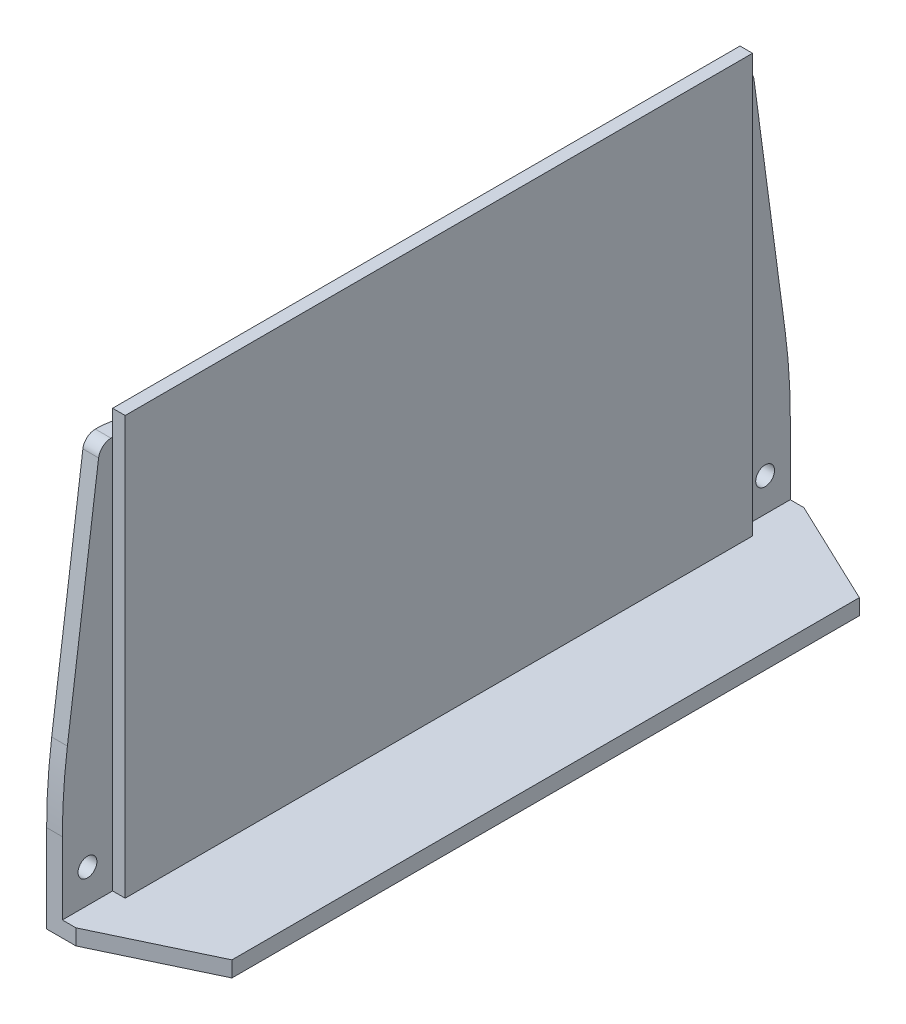
ISO-10303-21;
HEADER;
FILE_DESCRIPTION(('STEP AP214'),'2;1');
FILE_NAME('part.step','',(''),(''),'','','');
FILE_SCHEMA(('AUTOMOTIVE_DESIGN { 1 0 10303 214 1 1 1 1 }'));
ENDSEC;
DATA;
#1=APPLICATION_CONTEXT('core data for automotive mechanical design processes');
#2=APPLICATION_PROTOCOL_DEFINITION('international standard','automotive_design',2000,#1);
#3=PRODUCT_CONTEXT('',#1,'mechanical');
#4=PRODUCT('Part','Part','',(#3));
#5=PRODUCT_RELATED_PRODUCT_CATEGORY('part','',(#4));
#6=PRODUCT_DEFINITION_FORMATION('','',#4);
#7=PRODUCT_DEFINITION_CONTEXT('part definition',#1,'design');
#8=PRODUCT_DEFINITION('design','',#6,#7);
#9=PRODUCT_DEFINITION_SHAPE('','',#8);
#10=(LENGTH_UNIT() NAMED_UNIT(*) SI_UNIT(.MILLI.,.METRE.));
#11=(NAMED_UNIT(*) PLANE_ANGLE_UNIT() SI_UNIT($,.RADIAN.));
#12=(NAMED_UNIT(*) SI_UNIT($,.STERADIAN.) SOLID_ANGLE_UNIT());
#13=UNCERTAINTY_MEASURE_WITH_UNIT(LENGTH_MEASURE(1.E-05),#10,'distance_accuracy_value','');
#14=(GEOMETRIC_REPRESENTATION_CONTEXT(3) GLOBAL_UNCERTAINTY_ASSIGNED_CONTEXT((#13)) GLOBAL_UNIT_ASSIGNED_CONTEXT((#10,
#11,#12)) REPRESENTATION_CONTEXT('',''));
#15=CARTESIAN_POINT('',(0.,0.,0.));
#16=DIRECTION('',(0.,0.,1.));
#17=DIRECTION('',(1.,0.,0.));
#18=AXIS2_PLACEMENT_3D('',#15,#16,#17);
#19=CARTESIAN_POINT('',(184.161194233488,-77.8,105.558640417143));
#20=DIRECTION('',(-0.429125406036259,0.,0.903244920215008));
#21=DIRECTION('',(0.,1.,0.));
#22=AXIS2_PLACEMENT_3D('',#19,#20,#21);
#23=PLANE('',#22);
#24=DIRECTION('',(0.903244920215008,0.,0.429125406036259));
#25=VECTOR('',#24,1.);
#26=CARTESIAN_POINT('',(184.161194233488,-77.8,105.558640417143));
#27=LINE('',#26,#25);
#28=CARTESIAN_POINT('',(184.161194233488,-77.8,105.558640417143));
#29=VERTEX_POINT('',#28);
#30=CARTESIAN_POINT('',(201.,-77.8,113.558640417143));
#31=VERTEX_POINT('',#30);
#32=EDGE_CURVE('E318',#29,#31,#27,.T.);
#33=ORIENTED_EDGE('',*,*,#32,.F.);
#34=DIRECTION('',(0.,1.,0.));
#35=VECTOR('',#34,1.);
#36=CARTESIAN_POINT('',(184.161194233488,-77.8,105.558640417143));
#37=LINE('',#36,#35);
#38=CARTESIAN_POINT('',(184.161194233488,-75.3,105.558640417143));
#39=VERTEX_POINT('',#38);
#40=EDGE_CURVE('E28',#29,#39,#37,.T.);
#41=ORIENTED_EDGE('',*,*,#40,.T.);
#42=DIRECTION('',(0.903244920215008,0.,0.429125406036259));
#43=VECTOR('',#42,1.);
#44=CARTESIAN_POINT('',(184.161194233488,-75.3,105.558640417143));
#45=LINE('',#44,#43);
#46=CARTESIAN_POINT('',(201.,-75.3,113.558640417143));
#47=VERTEX_POINT('',#46);
#48=EDGE_CURVE('E351',#39,#47,#45,.T.);
#49=ORIENTED_EDGE('',*,*,#48,.T.);
#50=DIRECTION('',(0.,1.,0.));
#51=VECTOR('',#50,1.);
#52=CARTESIAN_POINT('',(201.,-59.286424689743,113.558640417143));
#53=LINE('',#52,#51);
#54=EDGE_CURVE('E499',#31,#47,#53,.T.);
#55=ORIENTED_EDGE('',*,*,#54,.F.);
#56=EDGE_LOOP('',(#33,#41,#49,#55));
#57=FACE_BOUND('',#56,.T.);
#58=ADVANCED_FACE('F17',(#57),#23,.F.);
#59=CARTESIAN_POINT('',(182.,-35.245698758972,108.558640417143));
#60=DIRECTION('',(0.,-0.132163720091018,0.991227900682635));
#61=DIRECTION('',(-1.,0.,0.));
#62=AXIS2_PLACEMENT_3D('',#59,#60,#61);
#63=PLANE('',#62);
#64=DIRECTION('',(-1.,0.,0.));
#65=VECTOR('',#64,1.);
#66=CARTESIAN_POINT('',(182.,-51.7258456024299,106.361287504682));
#67=LINE('',#66,#65);
#68=CARTESIAN_POINT('',(182.,-51.7258456024299,106.361287504682));
#69=VERTEX_POINT('',#68);
#70=CARTESIAN_POINT('',(179.5,-51.7258456024299,106.361287504682));
#71=VERTEX_POINT('',#70);
#72=EDGE_CURVE('E463',#69,#71,#67,.T.);
#73=ORIENTED_EDGE('',*,*,#72,.T.);
#74=DIRECTION('',(0.,-0.991227900682635,-0.132163720091018));
#75=VECTOR('',#74,1.);
#76=CARTESIAN_POINT('',(179.5,-40.1061985179581,107.910573782612));
#77=LINE('',#76,#75);
#78=CARTESIAN_POINT('',(179.5,-14.4813713187899,111.327217409168));
#79=VERTEX_POINT('',#78);
#80=EDGE_CURVE('E326',#79,#71,#77,.T.);
#81=ORIENTED_EDGE('',*,*,#80,.F.);
#82=DIRECTION('',(1.,0.,0.));
#83=VECTOR('',#82,1.);
#84=CARTESIAN_POINT('',(182.,-14.4813713187899,111.327217409168));
#85=LINE('',#84,#83);
#86=CARTESIAN_POINT('',(182.,-14.4813713187899,111.327217409168));
#87=VERTEX_POINT('',#86);
#88=EDGE_CURVE('E393',#79,#87,#85,.T.);
#89=ORIENTED_EDGE('',*,*,#88,.T.);
#90=DIRECTION('',(0.,0.991227900682635,0.132163720091018));
#91=VECTOR('',#90,1.);
#92=CARTESIAN_POINT('',(182.,-40.1061985179581,107.910573782612));
#93=LINE('',#92,#91);
#94=EDGE_CURVE('E11',#69,#87,#93,.T.);
#95=ORIENTED_EDGE('',*,*,#94,.F.);
#96=EDGE_LOOP('',(#73,#81,#89,#95));
#97=FACE_BOUND('',#96,.T.);
#98=ADVANCED_FACE('F552',(#97),#63,.F.);
#99=CARTESIAN_POINT('',(182.,-45.272849379486,109.558640417143));
#100=DIRECTION('',(1.,0.,0.));
#101=DIRECTION('',(0.,1.,0.));
#102=AXIS2_PLACEMENT_3D('',#99,#100,#101);
#103=PLANE('',#102);
#104=CARTESIAN_POINT('',(182.,-70.,109.558640417143));
#105=DIRECTION('',(-1.,0.,0.));
#106=DIRECTION('',(0.,0.,-1.));
#107=AXIS2_PLACEMENT_3D('',#104,#105,#106);
#108=CIRCLE('',#107,1.5);
#109=CARTESIAN_POINT('',(182.,-70.,111.058640417143));
#110=VERTEX_POINT('',#109);
#111=EDGE_CURVE('E467',#110,#110,#108,.T.);
#112=ORIENTED_EDGE('',*,*,#111,.T.);
#113=EDGE_LOOP('',(#112));
#114=FACE_BOUND('',#113,.T.);
#115=DIRECTION('',(0.,0.,1.));
#116=VECTOR('',#115,1.);
#117=CARTESIAN_POINT('',(182.,-75.3,109.558640417143));
#118=LINE('',#117,#116);
#119=CARTESIAN_POINT('',(182.,-75.3,105.558640417143));
#120=VERTEX_POINT('',#119);
#121=CARTESIAN_POINT('',(182.,-75.3,113.558640417143));
#122=VERTEX_POINT('',#121);
#123=EDGE_CURVE('E402',#120,#122,#118,.T.);
#124=ORIENTED_EDGE('',*,*,#123,.F.);
#125=DIRECTION('',(0.,-1.,0.));
#126=VECTOR('',#125,1.);
#127=CARTESIAN_POINT('',(182.,-12.745698758972,105.558640417143));
#128=LINE('',#127,#126);
#129=CARTESIAN_POINT('',(182.,-63.8188259907581,105.558640417143));
#130=VERTEX_POINT('',#129);
#131=EDGE_CURVE('E525',#130,#120,#128,.T.);
#132=ORIENTED_EDGE('',*,*,#131,.F.);
#133=CARTESIAN_POINT('',(182.,-63.8188259907581,197.058640417143));
#134=DIRECTION('',(1.,0.,0.));
#135=DIRECTION('',(0.,0.0662272576714655,-0.997804565203686));
#136=AXIS2_PLACEMENT_3D('',#133,#134,#135);
#137=CIRCLE('',#136,91.5);
#138=EDGE_CURVE('E370',#130,#69,#137,.T.);
#139=ORIENTED_EDGE('',*,*,#138,.T.);
#140=ORIENTED_EDGE('',*,*,#94,.T.);
#141=CARTESIAN_POINT('',(182.,-14.745698758972,113.309673210533));
#142=DIRECTION('',(1.,0.,0.));
#143=DIRECTION('',(0.,0.752384117353311,-0.65872463135553));
#144=AXIS2_PLACEMENT_3D('',#141,#142,#143);
#145=CIRCLE('',#144,2.);
#146=CARTESIAN_POINT('',(182.,-12.745698758972,113.309673210533));
#147=VERTEX_POINT('',#146);
#148=EDGE_CURVE('E479',#87,#147,#145,.T.);
#149=ORIENTED_EDGE('',*,*,#148,.T.);
#150=DIRECTION('',(0.,0.,-1.));
#151=VECTOR('',#150,1.);
#152=CARTESIAN_POINT('',(182.,-12.745698758972,113.558640417143));
#153=LINE('',#152,#151);
#154=CARTESIAN_POINT('',(182.,-12.745698758972,113.558640417143));
#155=VERTEX_POINT('',#154);
#156=EDGE_CURVE('E423',#155,#147,#153,.T.);
#157=ORIENTED_EDGE('',*,*,#156,.F.);
#158=DIRECTION('',(0.,1.,0.));
#159=VECTOR('',#158,1.);
#160=CARTESIAN_POINT('',(182.,-77.8,113.558640417143));
#161=LINE('',#160,#159);
#162=EDGE_CURVE('E429',#122,#155,#161,.T.);
#163=ORIENTED_EDGE('',*,*,#162,.F.);
#164=EDGE_LOOP('',(#124,#132,#139,#140,#149,#157,#163));
#165=FACE_BOUND('',#164,.T.);
#166=ADVANCED_FACE('F561',(#114,#165),#103,.T.);
#167=CARTESIAN_POINT('',(182.,-77.8,105.558640417143));
#168=DIRECTION('',(0.,0.,1.));
#169=DIRECTION('',(1.,0.,0.));
#170=AXIS2_PLACEMENT_3D('',#167,#168,#169);
#171=PLANE('',#170);
#172=DIRECTION('',(1.,0.,0.));
#173=VECTOR('',#172,1.);
#174=CARTESIAN_POINT('',(182.,-63.8188259907581,105.558640417143));
#175=LINE('',#174,#173);
#176=CARTESIAN_POINT('',(179.5,-63.8188259907581,105.558640417143));
#177=VERTEX_POINT('',#176);
#178=EDGE_CURVE('E374',#177,#130,#175,.T.);
#179=ORIENTED_EDGE('',*,*,#178,.T.);
#180=ORIENTED_EDGE('',*,*,#131,.T.);
#181=DIRECTION('',(1.,0.,0.));
#182=VECTOR('',#181,1.);
#183=CARTESIAN_POINT('',(182.,-75.3,105.558640417143));
#184=LINE('',#183,#182);
#185=EDGE_CURVE('E520',#120,#39,#184,.T.);
#186=ORIENTED_EDGE('',*,*,#185,.T.);
#187=ORIENTED_EDGE('',*,*,#40,.F.);
#188=DIRECTION('',(-1.,0.,0.));
#189=VECTOR('',#188,1.);
#190=CARTESIAN_POINT('',(182.,-77.8,105.558640417143));
#191=LINE('',#190,#189);
#192=CARTESIAN_POINT('',(179.5,-77.8,105.558640417143));
#193=VERTEX_POINT('',#192);
#194=EDGE_CURVE('E314',#29,#193,#191,.T.);
#195=ORIENTED_EDGE('',*,*,#194,.T.);
#196=DIRECTION('',(0.,1.,0.));
#197=VECTOR('',#196,1.);
#198=CARTESIAN_POINT('',(179.5,-12.745698758972,105.558640417143));
#199=LINE('',#198,#197);
#200=EDGE_CURVE('E420',#193,#177,#199,.T.);
#201=ORIENTED_EDGE('',*,*,#200,.T.);
#202=EDGE_LOOP('',(#179,#180,#186,#187,#195,#201));
#203=FACE_BOUND('',#202,.T.);
#204=ADVANCED_FACE('F650',(#203),#171,.F.);
#205=CARTESIAN_POINT('',(172.5,-77.8,122.981256706476));
#206=DIRECTION('',(0.,-1.,0.));
#207=DIRECTION('',(0.736842105263156,0.,-0.676064872561325));
#208=AXIS2_PLACEMENT_3D('',#205,#206,#207);
#209=CYLINDRICAL_SURFACE('',#208,9.5);
#210=DIRECTION('',(0.,-1.,0.));
#211=VECTOR('',#210,1.);
#212=CARTESIAN_POINT('',(180.75,-77.8,118.270895786122));
#213=LINE('',#212,#211);
#214=CARTESIAN_POINT('',(180.75,-12.745698758972,118.270895786122));
#215=VERTEX_POINT('',#214);
#216=CARTESIAN_POINT('',(180.75,-77.8,118.270895786122));
#217=VERTEX_POINT('',#216);
#218=EDGE_CURVE('E282',#215,#217,#213,.T.);
#219=ORIENTED_EDGE('',*,*,#218,.T.);
#220=CARTESIAN_POINT('',(172.5,-77.8,122.981256706476));
#221=DIRECTION('',(0.,1.,0.));
#222=DIRECTION('',(0.736842105263156,0.,-0.676064872561325));
#223=AXIS2_PLACEMENT_3D('',#220,#221,#222);
#224=CIRCLE('',#223,9.5);
#225=CARTESIAN_POINT('',(182.,-77.8,122.981256706476));
#226=VERTEX_POINT('',#225);
#227=EDGE_CURVE('E279',#226,#217,#224,.T.);
#228=ORIENTED_EDGE('',*,*,#227,.F.);
#229=DIRECTION('',(0.,-1.,0.));
#230=VECTOR('',#229,1.);
#231=CARTESIAN_POINT('',(182.,-77.8,122.981256706476));
#232=LINE('',#231,#230);
#233=CARTESIAN_POINT('',(182.,-12.745698758972,122.981256706476));
#234=VERTEX_POINT('',#233);
#235=EDGE_CURVE('E266',#234,#226,#232,.T.);
#236=ORIENTED_EDGE('',*,*,#235,.F.);
#237=CARTESIAN_POINT('',(172.5,-12.745698758972,122.981256706476));
#238=DIRECTION('',(0.,1.,0.));
#239=DIRECTION('',(0.736842105263156,0.,-0.676064872561325));
#240=AXIS2_PLACEMENT_3D('',#237,#238,#239);
#241=CIRCLE('',#240,9.5);
#242=EDGE_CURVE('E329',#234,#215,#241,.T.);
#243=ORIENTED_EDGE('',*,*,#242,.T.);
#244=EDGE_LOOP('',(#219,#228,#236,#243));
#245=FACE_BOUND('',#244,.T.);
#246=ADVANCED_FACE('F280',(#245),#209,.F.);
#247=CARTESIAN_POINT('',(191.5,-43.272849379486,113.558640417143));
#248=DIRECTION('',(0.,0.,-1.));
#249=DIRECTION('',(0.,-1.,0.));
#250=AXIS2_PLACEMENT_3D('',#247,#248,#249);
#251=PLANE('',#250);
#252=DIRECTION('',(1.,0.,0.));
#253=VECTOR('',#252,1.);
#254=CARTESIAN_POINT('',(191.5,-75.3,113.558640417143));
#255=LINE('',#254,#253);
#256=CARTESIAN_POINT('',(184.,-75.3,113.558640417143));
#257=VERTEX_POINT('',#256);
#258=EDGE_CURVE('E397',#122,#257,#255,.T.);
#259=ORIENTED_EDGE('',*,*,#258,.F.);
#260=ORIENTED_EDGE('',*,*,#162,.T.);
#261=DIRECTION('',(0.,-1.,0.));
#262=VECTOR('',#261,1.);
#263=CARTESIAN_POINT('',(182.,-60.536424689743,113.558640417143));
#264=LINE('',#263,#262);
#265=CARTESIAN_POINT('',(182.,-8.74569875897197,113.558640417143));
#266=VERTEX_POINT('',#265);
#267=EDGE_CURVE('E431',#266,#155,#264,.T.);
#268=ORIENTED_EDGE('',*,*,#267,.F.);
#269=DIRECTION('',(-1.,0.,0.));
#270=VECTOR('',#269,1.);
#271=CARTESIAN_POINT('',(186.75,-8.74569875897197,113.558640417143));
#272=LINE('',#271,#270);
#273=CARTESIAN_POINT('',(184.,-8.74569875897197,113.558640417143));
#274=VERTEX_POINT('',#273);
#275=EDGE_CURVE('E313',#274,#266,#272,.T.);
#276=ORIENTED_EDGE('',*,*,#275,.F.);
#277=DIRECTION('',(0.,1.,0.));
#278=VECTOR('',#277,1.);
#279=CARTESIAN_POINT('',(184.,-26.009274069229,113.558640417143));
#280=LINE('',#279,#278);
#281=EDGE_CURVE('E42',#257,#274,#280,.T.);
#282=ORIENTED_EDGE('',*,*,#281,.F.);
#283=EDGE_LOOP('',(#259,#260,#268,#276,#282));
#284=FACE_BOUND('',#283,.T.);
#285=ADVANCED_FACE('F738',(#284),#251,.T.);
#286=CARTESIAN_POINT('',(182.,-12.745698758972,105.558640417143));
#287=DIRECTION('',(0.,-1.,0.));
#288=DIRECTION('',(0.,0.,-1.));
#289=AXIS2_PLACEMENT_3D('',#286,#287,#288);
#290=PLANE('',#289);
#291=DIRECTION('',(-1.,0.,0.));
#292=VECTOR('',#291,1.);
#293=CARTESIAN_POINT('',(182.,-12.745698758972,113.309673210533));
#294=LINE('',#293,#292);
#295=CARTESIAN_POINT('',(179.5,-12.745698758972,113.309673210533));
#296=VERTEX_POINT('',#295);
#297=EDGE_CURVE('E462',#147,#296,#294,.T.);
#298=ORIENTED_EDGE('',*,*,#297,.T.);
#299=DIRECTION('',(0.,0.,1.));
#300=VECTOR('',#299,1.);
#301=CARTESIAN_POINT('',(179.5,-12.745698758972,113.558640417143));
#302=LINE('',#301,#300);
#303=CARTESIAN_POINT('',(179.5,-12.745698758972,113.560534865767));
#304=VERTEX_POINT('',#303);
#305=EDGE_CURVE('E330',#296,#304,#302,.T.);
#306=ORIENTED_EDGE('',*,*,#305,.T.);
#307=CARTESIAN_POINT('',(189.,-12.745698758972,113.560534865767));
#308=DIRECTION('',(0.,1.,0.));
#309=DIRECTION('',(-0.966545666958261,0.,0.256494588021289));
#310=AXIS2_PLACEMENT_3D('',#307,#308,#309);
#311=CIRCLE('',#310,9.5);
#312=EDGE_CURVE('E389',#304,#215,#311,.T.);
#313=ORIENTED_EDGE('',*,*,#312,.T.);
#314=ORIENTED_EDGE('',*,*,#242,.F.);
#315=DIRECTION('',(0.,0.,-1.));
#316=VECTOR('',#315,1.);
#317=CARTESIAN_POINT('',(182.,-12.745698758972,113.408640417143));
#318=LINE('',#317,#316);
#319=EDGE_CURVE('E274',#234,#155,#318,.T.);
#320=ORIENTED_EDGE('',*,*,#319,.T.);
#321=ORIENTED_EDGE('',*,*,#156,.T.);
#322=EDGE_LOOP('',(#298,#306,#313,#314,#320,#321));
#323=FACE_BOUND('',#322,.T.);
#324=ADVANCED_FACE('F743',(#323),#290,.F.);
#325=CARTESIAN_POINT('',(179.5,-45.272849379486,109.558640417143));
#326=DIRECTION('',(1.,0.,0.));
#327=DIRECTION('',(0.,1.,0.));
#328=AXIS2_PLACEMENT_3D('',#325,#326,#327);
#329=PLANE('',#328);
#330=CARTESIAN_POINT('',(179.5,-70.,109.558640417143));
#331=DIRECTION('',(-1.,0.,0.));
#332=DIRECTION('',(0.,0.,-1.));
#333=AXIS2_PLACEMENT_3D('',#330,#331,#332);
#334=CIRCLE('',#333,1.5);
#335=CARTESIAN_POINT('',(179.5,-70.,111.058640417143));
#336=VERTEX_POINT('',#335);
#337=EDGE_CURVE('E468',#336,#336,#334,.T.);
#338=ORIENTED_EDGE('',*,*,#337,.F.);
#339=EDGE_LOOP('',(#338));
#340=FACE_BOUND('',#339,.T.);
#341=CARTESIAN_POINT('',(179.5,-63.8188259907581,197.058640417143));
#342=DIRECTION('',(-1.,0.,0.));
#343=DIRECTION('',(0.,0.0662272576714655,-0.997804565203686));
#344=AXIS2_PLACEMENT_3D('',#341,#342,#343);
#345=CIRCLE('',#344,91.5);
#346=EDGE_CURVE('E388',#71,#177,#345,.T.);
#347=ORIENTED_EDGE('',*,*,#346,.T.);
#348=ORIENTED_EDGE('',*,*,#200,.F.);
#349=DIRECTION('',(0.,0.,1.));
#350=VECTOR('',#349,1.);
#351=CARTESIAN_POINT('',(179.5,-77.8,113.558640417143));
#352=LINE('',#351,#350);
#353=CARTESIAN_POINT('',(179.5,-77.8,113.560534865767));
#354=VERTEX_POINT('',#353);
#355=EDGE_CURVE('E287',#193,#354,#352,.T.);
#356=ORIENTED_EDGE('',*,*,#355,.T.);
#357=DIRECTION('',(0.,1.,0.));
#358=VECTOR('',#357,1.);
#359=CARTESIAN_POINT('',(179.5,-77.8,113.560534865767));
#360=LINE('',#359,#358);
#361=EDGE_CURVE('E310',#354,#304,#360,.T.);
#362=ORIENTED_EDGE('',*,*,#361,.T.);
#363=ORIENTED_EDGE('',*,*,#305,.F.);
#364=CARTESIAN_POINT('',(179.5,-14.745698758972,113.309673210533));
#365=DIRECTION('',(-1.,0.,0.));
#366=DIRECTION('',(0.,0.752384117353311,-0.65872463135553));
#367=AXIS2_PLACEMENT_3D('',#364,#365,#366);
#368=CIRCLE('',#367,2.);
#369=EDGE_CURVE('E458',#296,#79,#368,.T.);
#370=ORIENTED_EDGE('',*,*,#369,.T.);
#371=ORIENTED_EDGE('',*,*,#80,.T.);
#372=EDGE_LOOP('',(#347,#348,#356,#362,#363,#370,#371));
#373=FACE_BOUND('',#372,.T.);
#374=ADVANCED_FACE('F849',(#340,#373),#329,.F.);
#375=CARTESIAN_POINT('',(184.,-8.74569875897197,213.741359582857));
#376=DIRECTION('',(1.,0.,0.));
#377=DIRECTION('',(0.,1.,0.));
#378=AXIS2_PLACEMENT_3D('',#375,#376,#377);
#379=PLANE('',#378);
#380=DIRECTION('',(0.,0.,-1.));
#381=VECTOR('',#380,1.);
#382=CARTESIAN_POINT('',(184.,-8.74569875897197,213.741359582857));
#383=LINE('',#382,#381);
#384=CARTESIAN_POINT('',(184.,-8.74569875897197,213.441359582857));
#385=VERTEX_POINT('',#384);
#386=EDGE_CURVE('E233',#385,#274,#383,.T.);
#387=ORIENTED_EDGE('',*,*,#386,.F.);
#388=DIRECTION('',(0.,1.,0.));
#389=VECTOR('',#388,1.);
#390=CARTESIAN_POINT('',(184.,-26.009274069229,213.441359582857));
#391=LINE('',#390,#389);
#392=CARTESIAN_POINT('',(184.,-75.3,213.441359582857));
#393=VERTEX_POINT('',#392);
#394=EDGE_CURVE('E346',#393,#385,#391,.T.);
#395=ORIENTED_EDGE('',*,*,#394,.F.);
#396=DIRECTION('',(0.,0.,1.));
#397=VECTOR('',#396,1.);
#398=CARTESIAN_POINT('',(184.,-75.3,113.258640417143));
#399=LINE('',#398,#397);
#400=EDGE_CURVE('E367',#257,#393,#399,.T.);
#401=ORIENTED_EDGE('',*,*,#400,.F.);
#402=ORIENTED_EDGE('',*,*,#281,.T.);
#403=EDGE_LOOP('',(#387,#395,#401,#402));
#404=FACE_BOUND('',#403,.T.);
#405=ADVANCED_FACE('F841',(#404),#379,.T.);
#406=CARTESIAN_POINT('',(182.,-8.74569875897197,213.741359582857));
#407=DIRECTION('',(0.,1.,0.));
#408=DIRECTION('',(1.,0.,0.));
#409=AXIS2_PLACEMENT_3D('',#406,#407,#408);
#410=PLANE('',#409);
#411=DIRECTION('',(0.,0.,-1.));
#412=VECTOR('',#411,1.);
#413=CARTESIAN_POINT('',(182.,-8.74569875897197,213.741359582857));
#414=LINE('',#413,#412);
#415=CARTESIAN_POINT('',(182.,-8.74569875897197,213.441359582857));
#416=VERTEX_POINT('',#415);
#417=EDGE_CURVE('E242',#416,#266,#414,.T.);
#418=ORIENTED_EDGE('',*,*,#417,.F.);
#419=DIRECTION('',(-1.,0.,0.));
#420=VECTOR('',#419,1.);
#421=CARTESIAN_POINT('',(186.75,-8.74569875897197,213.441359582857));
#422=LINE('',#421,#420);
#423=EDGE_CURVE('E341',#385,#416,#422,.T.);
#424=ORIENTED_EDGE('',*,*,#423,.F.);
#425=ORIENTED_EDGE('',*,*,#386,.T.);
#426=ORIENTED_EDGE('',*,*,#275,.T.);
#427=EDGE_LOOP('',(#418,#424,#425,#426));
#428=FACE_BOUND('',#427,.T.);
#429=ADVANCED_FACE('F786',(#428),#410,.T.);
#430=CARTESIAN_POINT('',(182.,-77.8,213.741359582857));
#431=DIRECTION('',(-1.,0.,0.));
#432=DIRECTION('',(0.,0.,1.));
#433=AXIS2_PLACEMENT_3D('',#430,#431,#432);
#434=PLANE('',#433);
#435=DIRECTION('',(0.,0.,-1.));
#436=VECTOR('',#435,1.);
#437=CARTESIAN_POINT('',(182.,-77.8,213.741359582857));
#438=LINE('',#437,#436);
#439=CARTESIAN_POINT('',(182.,-77.8,204.018743293524));
#440=VERTEX_POINT('',#439);
#441=EDGE_CURVE('E270',#440,#226,#438,.T.);
#442=ORIENTED_EDGE('',*,*,#441,.F.);
#443=DIRECTION('',(0.,-1.,0.));
#444=VECTOR('',#443,1.);
#445=CARTESIAN_POINT('',(182.,-77.8,204.018743293524));
#446=LINE('',#445,#444);
#447=CARTESIAN_POINT('',(182.,-12.745698758972,204.018743293524));
#448=VERTEX_POINT('',#447);
#449=EDGE_CURVE('E414',#448,#440,#446,.T.);
#450=ORIENTED_EDGE('',*,*,#449,.F.);
#451=DIRECTION('',(0.,0.,1.));
#452=VECTOR('',#451,1.);
#453=CARTESIAN_POINT('',(182.,-12.745698758972,213.591359582857));
#454=LINE('',#453,#452);
#455=CARTESIAN_POINT('',(182.,-12.745698758972,213.441359582857));
#456=VERTEX_POINT('',#455);
#457=EDGE_CURVE('E319',#448,#456,#454,.T.);
#458=ORIENTED_EDGE('',*,*,#457,.T.);
#459=DIRECTION('',(0.,-1.,0.));
#460=VECTOR('',#459,1.);
#461=CARTESIAN_POINT('',(182.,-60.536424689743,213.441359582857));
#462=LINE('',#461,#460);
#463=EDGE_CURVE('E345',#416,#456,#462,.T.);
#464=ORIENTED_EDGE('',*,*,#463,.F.);
#465=ORIENTED_EDGE('',*,*,#417,.T.);
#466=ORIENTED_EDGE('',*,*,#267,.T.);
#467=ORIENTED_EDGE('',*,*,#319,.F.);
#468=ORIENTED_EDGE('',*,*,#235,.T.);
#469=EDGE_LOOP('',(#442,#450,#458,#464,#465,#466,#467,#468));
#470=FACE_BOUND('',#469,.T.);
#471=ADVANCED_FACE('F268',(#470),#434,.T.);
#472=CARTESIAN_POINT('',(184.161194233488,-77.8,221.441359582857));
#473=DIRECTION('',(0.429125406036259,0.,0.903244920215008));
#474=DIRECTION('',(0.,-1.,0.));
#475=AXIS2_PLACEMENT_3D('',#472,#473,#474);
#476=PLANE('',#475);
#477=DIRECTION('',(0.903244920215008,0.,-0.429125406036259));
#478=VECTOR('',#477,1.);
#479=CARTESIAN_POINT('',(184.161194233488,-77.8,221.441359582857));
#480=LINE('',#479,#478);
#481=CARTESIAN_POINT('',(184.161194233488,-77.8,221.441359582857));
#482=VERTEX_POINT('',#481);
#483=CARTESIAN_POINT('',(201.,-77.8,213.441359582857));
#484=VERTEX_POINT('',#483);
#485=EDGE_CURVE('E301',#482,#484,#480,.T.);
#486=ORIENTED_EDGE('',*,*,#485,.T.);
#487=DIRECTION('',(0.,1.,0.));
#488=VECTOR('',#487,1.);
#489=CARTESIAN_POINT('',(201.,-59.286424689743,213.441359582857));
#490=LINE('',#489,#488);
#491=CARTESIAN_POINT('',(201.,-75.3,213.441359582857));
#492=VERTEX_POINT('',#491);
#493=EDGE_CURVE('E401',#484,#492,#490,.T.);
#494=ORIENTED_EDGE('',*,*,#493,.T.);
#495=DIRECTION('',(0.903244920215008,0.,-0.429125406036259));
#496=VECTOR('',#495,1.);
#497=CARTESIAN_POINT('',(184.161194233488,-75.3,221.441359582857));
#498=LINE('',#497,#496);
#499=CARTESIAN_POINT('',(184.161194233488,-75.3,221.441359582857));
#500=VERTEX_POINT('',#499);
#501=EDGE_CURVE('E352',#500,#492,#498,.T.);
#502=ORIENTED_EDGE('',*,*,#501,.F.);
#503=DIRECTION('',(0.,1.,0.));
#504=VECTOR('',#503,1.);
#505=CARTESIAN_POINT('',(184.161194233488,-77.8,221.441359582857));
#506=LINE('',#505,#504);
#507=EDGE_CURVE('E258',#482,#500,#506,.T.);
#508=ORIENTED_EDGE('',*,*,#507,.F.);
#509=EDGE_LOOP('',(#486,#494,#502,#508));
#510=FACE_BOUND('',#509,.T.);
#511=ADVANCED_FACE('F636',(#510),#476,.T.);
#512=CARTESIAN_POINT('',(182.,-35.245698758972,218.441359582857));
#513=DIRECTION('',(0.,0.132163720091018,0.991227900682635));
#514=DIRECTION('',(1.,0.,0.));
#515=AXIS2_PLACEMENT_3D('',#512,#513,#514);
#516=PLANE('',#515);
#517=DIRECTION('',(-1.,0.,0.));
#518=VECTOR('',#517,1.);
#519=CARTESIAN_POINT('',(182.,-51.7258456024299,220.638712495318));
#520=LINE('',#519,#518);
#521=CARTESIAN_POINT('',(182.,-51.7258456024299,220.638712495318));
#522=VERTEX_POINT('',#521);
#523=CARTESIAN_POINT('',(179.5,-51.7258456024299,220.638712495318));
#524=VERTEX_POINT('',#523);
#525=EDGE_CURVE('E410',#522,#524,#520,.T.);
#526=ORIENTED_EDGE('',*,*,#525,.F.);
#527=DIRECTION('',(0.,0.991227900682635,-0.132163720091018));
#528=VECTOR('',#527,1.);
#529=CARTESIAN_POINT('',(182.,-40.1061985179581,219.089426217388));
#530=LINE('',#529,#528);
#531=CARTESIAN_POINT('',(182.,-14.4813713187899,215.672782590832));
#532=VERTEX_POINT('',#531);
#533=EDGE_CURVE('E375',#522,#532,#530,.T.);
#534=ORIENTED_EDGE('',*,*,#533,.T.);
#535=DIRECTION('',(1.,0.,0.));
#536=VECTOR('',#535,1.);
#537=CARTESIAN_POINT('',(182.,-14.4813713187899,215.672782590832));
#538=LINE('',#537,#536);
#539=CARTESIAN_POINT('',(179.5,-14.4813713187899,215.672782590832));
#540=VERTEX_POINT('',#539);
#541=EDGE_CURVE('E454',#540,#532,#538,.T.);
#542=ORIENTED_EDGE('',*,*,#541,.F.);
#543=DIRECTION('',(0.,-0.991227900682635,0.132163720091018));
#544=VECTOR('',#543,1.);
#545=CARTESIAN_POINT('',(179.5,-40.1061985179581,219.089426217388));
#546=LINE('',#545,#544);
#547=EDGE_CURVE('E396',#540,#524,#546,.T.);
#548=ORIENTED_EDGE('',*,*,#547,.T.);
#549=EDGE_LOOP('',(#526,#534,#542,#548));
#550=FACE_BOUND('',#549,.T.);
#551=ADVANCED_FACE('F580',(#550),#516,.T.);
#552=CARTESIAN_POINT('',(182.,-45.272849379486,217.441359582857));
#553=DIRECTION('',(-1.,0.,0.));
#554=DIRECTION('',(0.,0.,1.));
#555=AXIS2_PLACEMENT_3D('',#552,#553,#554);
#556=PLANE('',#555);
#557=CARTESIAN_POINT('',(182.,-70.,217.441359582857));
#558=DIRECTION('',(1.,0.,0.));
#559=DIRECTION('',(0.,0.,1.));
#560=AXIS2_PLACEMENT_3D('',#557,#558,#559);
#561=CIRCLE('',#560,1.5);
#562=CARTESIAN_POINT('',(182.,-70.,215.941359582857));
#563=VERTEX_POINT('',#562);
#564=EDGE_CURVE('E358',#563,#563,#561,.T.);
#565=ORIENTED_EDGE('',*,*,#564,.F.);
#566=EDGE_LOOP('',(#565));
#567=FACE_BOUND('',#566,.T.);
#568=DIRECTION('',(0.,0.,-1.));
#569=VECTOR('',#568,1.);
#570=CARTESIAN_POINT('',(182.,-75.3,217.441359582857));
#571=LINE('',#570,#569);
#572=CARTESIAN_POINT('',(182.,-75.3,221.441359582857));
#573=VERTEX_POINT('',#572);
#574=CARTESIAN_POINT('',(182.,-75.3,213.441359582857));
#575=VERTEX_POINT('',#574);
#576=EDGE_CURVE('E21',#573,#575,#571,.T.);
#577=ORIENTED_EDGE('',*,*,#576,.T.);
#578=DIRECTION('',(0.,1.,0.));
#579=VECTOR('',#578,1.);
#580=CARTESIAN_POINT('',(182.,-77.8,213.441359582857));
#581=LINE('',#580,#579);
#582=EDGE_CURVE('E363',#575,#456,#581,.T.);
#583=ORIENTED_EDGE('',*,*,#582,.T.);
#584=DIRECTION('',(0.,0.,1.));
#585=VECTOR('',#584,1.);
#586=CARTESIAN_POINT('',(182.,-12.745698758972,213.441359582857));
#587=LINE('',#586,#585);
#588=CARTESIAN_POINT('',(182.,-12.745698758972,213.690326789467));
#589=VERTEX_POINT('',#588);
#590=EDGE_CURVE('E305',#456,#589,#587,.T.);
#591=ORIENTED_EDGE('',*,*,#590,.T.);
#592=CARTESIAN_POINT('',(182.,-14.745698758972,213.690326789467));
#593=DIRECTION('',(-1.,0.,0.));
#594=DIRECTION('',(0.,0.752384117353307,0.658724631355534));
#595=AXIS2_PLACEMENT_3D('',#592,#593,#594);
#596=CIRCLE('',#595,2.);
#597=EDGE_CURVE('E384',#532,#589,#596,.T.);
#598=ORIENTED_EDGE('',*,*,#597,.F.);
#599=ORIENTED_EDGE('',*,*,#533,.F.);
#600=CARTESIAN_POINT('',(182.,-63.8188259907581,129.941359582857));
#601=DIRECTION('',(-1.,0.,0.));
#602=DIRECTION('',(0.,0.0662272576714655,0.997804565203686));
#603=AXIS2_PLACEMENT_3D('',#600,#601,#602);
#604=CIRCLE('',#603,91.5);
#605=CARTESIAN_POINT('',(182.,-63.8188259907581,221.441359582857));
#606=VERTEX_POINT('',#605);
#607=EDGE_CURVE('E406',#606,#522,#604,.T.);
#608=ORIENTED_EDGE('',*,*,#607,.F.);
#609=DIRECTION('',(0.,-1.,0.));
#610=VECTOR('',#609,1.);
#611=CARTESIAN_POINT('',(182.,-12.745698758972,221.441359582857));
#612=LINE('',#611,#610);
#613=EDGE_CURVE('E378',#606,#573,#612,.T.);
#614=ORIENTED_EDGE('',*,*,#613,.T.);
#615=EDGE_LOOP('',(#577,#583,#591,#598,#599,#608,#614));
#616=FACE_BOUND('',#615,.T.);
#617=ADVANCED_FACE('F19',(#567,#616),#556,.F.);
#618=CARTESIAN_POINT('',(182.,-77.8,221.441359582857));
#619=DIRECTION('',(0.,0.,1.));
#620=DIRECTION('',(1.,0.,0.));
#621=AXIS2_PLACEMENT_3D('',#618,#619,#620);
#622=PLANE('',#621);
#623=DIRECTION('',(1.,0.,0.));
#624=VECTOR('',#623,1.);
#625=CARTESIAN_POINT('',(182.,-63.8188259907581,221.441359582857));
#626=LINE('',#625,#624);
#627=CARTESIAN_POINT('',(179.5,-63.8188259907581,221.441359582857));
#628=VERTEX_POINT('',#627);
#629=EDGE_CURVE('E411',#628,#606,#626,.T.);
#630=ORIENTED_EDGE('',*,*,#629,.F.);
#631=DIRECTION('',(0.,1.,0.));
#632=VECTOR('',#631,1.);
#633=CARTESIAN_POINT('',(179.5,-12.745698758972,221.441359582857));
#634=LINE('',#633,#632);
#635=CARTESIAN_POINT('',(179.5,-77.8,221.441359582857));
#636=VERTEX_POINT('',#635);
#637=EDGE_CURVE('E331',#636,#628,#634,.T.);
#638=ORIENTED_EDGE('',*,*,#637,.F.);
#639=DIRECTION('',(-1.,0.,0.));
#640=VECTOR('',#639,1.);
#641=CARTESIAN_POINT('',(182.,-77.8,221.441359582857));
#642=LINE('',#641,#640);
#643=EDGE_CURVE('E295',#482,#636,#642,.T.);
#644=ORIENTED_EDGE('',*,*,#643,.F.);
#645=ORIENTED_EDGE('',*,*,#507,.T.);
#646=DIRECTION('',(1.,0.,0.));
#647=VECTOR('',#646,1.);
#648=CARTESIAN_POINT('',(182.,-75.3,221.441359582857));
#649=LINE('',#648,#647);
#650=EDGE_CURVE('E482',#573,#500,#649,.T.);
#651=ORIENTED_EDGE('',*,*,#650,.F.);
#652=ORIENTED_EDGE('',*,*,#613,.F.);
#653=EDGE_LOOP('',(#630,#638,#644,#645,#651,#652));
#654=FACE_BOUND('',#653,.T.);
#655=ADVANCED_FACE('F590',(#654),#622,.T.);
#656=CARTESIAN_POINT('',(182.,-77.8,213.441359582857));
#657=DIRECTION('',(0.,-1.,0.));
#658=DIRECTION('',(0.,0.,-1.));
#659=AXIS2_PLACEMENT_3D('',#656,#657,#658);
#660=PLANE('',#659);
#661=DIRECTION('',(0.,0.,-1.));
#662=VECTOR('',#661,1.);
#663=CARTESIAN_POINT('',(201.,-77.8,213.741359582857));
#664=LINE('',#663,#662);
#665=EDGE_CURVE('E405',#484,#31,#664,.T.);
#666=ORIENTED_EDGE('',*,*,#665,.F.);
#667=ORIENTED_EDGE('',*,*,#485,.F.);
#668=ORIENTED_EDGE('',*,*,#643,.T.);
#669=DIRECTION('',(0.,0.,-1.));
#670=VECTOR('',#669,1.);
#671=CARTESIAN_POINT('',(179.5,-77.8,213.441359582857));
#672=LINE('',#671,#670);
#673=CARTESIAN_POINT('',(179.5,-77.8,213.439465134233));
#674=VERTEX_POINT('',#673);
#675=EDGE_CURVE('E334',#636,#674,#672,.T.);
#676=ORIENTED_EDGE('',*,*,#675,.T.);
#677=CARTESIAN_POINT('',(189.,-77.8,213.439465134233));
#678=DIRECTION('',(0.,1.,0.));
#679=DIRECTION('',(-0.966545666958261,0.,-0.256494588021289));
#680=AXIS2_PLACEMENT_3D('',#677,#678,#679);
#681=CIRCLE('',#680,9.5);
#682=CARTESIAN_POINT('',(180.75,-77.8,208.729104213878));
#683=VERTEX_POINT('',#682);
#684=EDGE_CURVE('E494',#683,#674,#681,.T.);
#685=ORIENTED_EDGE('',*,*,#684,.F.);
#686=CARTESIAN_POINT('',(172.5,-77.8,204.018743293524));
#687=DIRECTION('',(0.,-1.,0.));
#688=DIRECTION('',(0.736842105263156,0.,0.676064872561325));
#689=AXIS2_PLACEMENT_3D('',#686,#687,#688);
#690=CIRCLE('',#689,9.5);
#691=EDGE_CURVE('E292',#440,#683,#690,.T.);
#692=ORIENTED_EDGE('',*,*,#691,.F.);
#693=ORIENTED_EDGE('',*,*,#441,.T.);
#694=ORIENTED_EDGE('',*,*,#227,.T.);
#695=CARTESIAN_POINT('',(189.,-77.8,113.560534865767));
#696=DIRECTION('',(0.,-1.,0.));
#697=DIRECTION('',(-0.966545666958261,0.,0.256494588021289));
#698=AXIS2_PLACEMENT_3D('',#695,#696,#697);
#699=CIRCLE('',#698,9.5);
#700=EDGE_CURVE('E307',#217,#354,#699,.T.);
#701=ORIENTED_EDGE('',*,*,#700,.T.);
#702=ORIENTED_EDGE('',*,*,#355,.F.);
#703=ORIENTED_EDGE('',*,*,#194,.F.);
#704=ORIENTED_EDGE('',*,*,#32,.T.);
#705=EDGE_LOOP('',(#666,#667,#668,#676,#685,#692,#693,#694,#701,#702,#703,#704));
#706=FACE_BOUND('',#705,.T.);
#707=ADVANCED_FACE('F290',(#706),#660,.T.);
#708=CARTESIAN_POINT('',(172.5,-77.8,204.018743293524));
#709=DIRECTION('',(0.,1.,0.));
#710=DIRECTION('',(0.736842105263156,0.,0.676064872561325));
#711=AXIS2_PLACEMENT_3D('',#708,#709,#710);
#712=CYLINDRICAL_SURFACE('',#711,9.5);
#713=DIRECTION('',(0.,-1.,0.));
#714=VECTOR('',#713,1.);
#715=CARTESIAN_POINT('',(180.75,-77.8,208.729104213878));
#716=LINE('',#715,#714);
#717=CARTESIAN_POINT('',(180.75,-12.745698758972,208.729104213878));
#718=VERTEX_POINT('',#717);
#719=EDGE_CURVE('E339',#718,#683,#716,.T.);
#720=ORIENTED_EDGE('',*,*,#719,.F.);
#721=CARTESIAN_POINT('',(172.5,-12.745698758972,204.018743293524));
#722=DIRECTION('',(0.,-1.,0.));
#723=DIRECTION('',(0.736842105263156,0.,0.676064872561325));
#724=AXIS2_PLACEMENT_3D('',#721,#722,#723);
#725=CIRCLE('',#724,9.5);
#726=EDGE_CURVE('E323',#448,#718,#725,.T.);
#727=ORIENTED_EDGE('',*,*,#726,.F.);
#728=ORIENTED_EDGE('',*,*,#449,.T.);
#729=ORIENTED_EDGE('',*,*,#691,.T.);
#730=EDGE_LOOP('',(#720,#727,#728,#729));
#731=FACE_BOUND('',#730,.T.);
#732=ADVANCED_FACE('F731',(#731),#712,.F.);
#733=CARTESIAN_POINT('',(201.,-75.3,213.741359582857));
#734=DIRECTION('',(1.,0.,0.));
#735=DIRECTION('',(0.,1.,0.));
#736=AXIS2_PLACEMENT_3D('',#733,#734,#735);
#737=PLANE('',#736);
#738=DIRECTION('',(0.,0.,-1.));
#739=VECTOR('',#738,1.);
#740=CARTESIAN_POINT('',(201.,-75.3,213.741359582857));
#741=LINE('',#740,#739);
#742=EDGE_CURVE('E347',#492,#47,#741,.T.);
#743=ORIENTED_EDGE('',*,*,#742,.F.);
#744=ORIENTED_EDGE('',*,*,#493,.F.);
#745=ORIENTED_EDGE('',*,*,#665,.T.);
#746=ORIENTED_EDGE('',*,*,#54,.T.);
#747=EDGE_LOOP('',(#743,#744,#745,#746));
#748=FACE_BOUND('',#747,.T.);
#749=ADVANCED_FACE('F725',(#748),#737,.T.);
#750=CARTESIAN_POINT('',(184.,-75.3,213.741359582857));
#751=DIRECTION('',(0.,1.,0.));
#752=DIRECTION('',(1.,0.,0.));
#753=AXIS2_PLACEMENT_3D('',#750,#751,#752);
#754=PLANE('',#753);
#755=ORIENTED_EDGE('',*,*,#400,.T.);
#756=DIRECTION('',(1.,0.,0.));
#757=VECTOR('',#756,1.);
#758=CARTESIAN_POINT('',(191.5,-75.3,213.441359582857));
#759=LINE('',#758,#757);
#760=EDGE_CURVE('E362',#575,#393,#759,.T.);
#761=ORIENTED_EDGE('',*,*,#760,.F.);
#762=ORIENTED_EDGE('',*,*,#576,.F.);
#763=ORIENTED_EDGE('',*,*,#650,.T.);
#764=ORIENTED_EDGE('',*,*,#501,.T.);
#765=ORIENTED_EDGE('',*,*,#742,.T.);
#766=ORIENTED_EDGE('',*,*,#48,.F.);
#767=ORIENTED_EDGE('',*,*,#185,.F.);
#768=ORIENTED_EDGE('',*,*,#123,.T.);
#769=ORIENTED_EDGE('',*,*,#258,.T.);
#770=EDGE_LOOP('',(#755,#761,#762,#763,#764,#765,#766,#767,#768,#769));
#771=FACE_BOUND('',#770,.T.);
#772=ADVANCED_FACE('F730',(#771),#754,.T.);
#773=CARTESIAN_POINT('',(191.5,-43.272849379486,213.441359582857));
#774=DIRECTION('',(0.,0.,-1.));
#775=DIRECTION('',(0.,-1.,0.));
#776=AXIS2_PLACEMENT_3D('',#773,#774,#775);
#777=PLANE('',#776);
#778=ORIENTED_EDGE('',*,*,#760,.T.);
#779=ORIENTED_EDGE('',*,*,#394,.T.);
#780=ORIENTED_EDGE('',*,*,#423,.T.);
#781=ORIENTED_EDGE('',*,*,#463,.T.);
#782=ORIENTED_EDGE('',*,*,#582,.F.);
#783=EDGE_LOOP('',(#778,#779,#780,#781,#782));
#784=FACE_BOUND('',#783,.T.);
#785=ADVANCED_FACE('F685',(#784),#777,.F.);
#786=CARTESIAN_POINT('',(182.,-12.745698758972,221.441359582857));
#787=DIRECTION('',(0.,1.,0.));
#788=DIRECTION('',(1.,0.,0.));
#789=AXIS2_PLACEMENT_3D('',#786,#787,#788);
#790=PLANE('',#789);
#791=DIRECTION('',(-1.,0.,0.));
#792=VECTOR('',#791,1.);
#793=CARTESIAN_POINT('',(182.,-12.745698758972,213.690326789467));
#794=LINE('',#793,#792);
#795=CARTESIAN_POINT('',(179.5,-12.745698758972,213.690326789467));
#796=VERTEX_POINT('',#795);
#797=EDGE_CURVE('E379',#589,#796,#794,.T.);
#798=ORIENTED_EDGE('',*,*,#797,.F.);
#799=ORIENTED_EDGE('',*,*,#590,.F.);
#800=ORIENTED_EDGE('',*,*,#457,.F.);
#801=ORIENTED_EDGE('',*,*,#726,.T.);
#802=CARTESIAN_POINT('',(189.,-12.745698758972,213.439465134233));
#803=DIRECTION('',(0.,-1.,0.));
#804=DIRECTION('',(-0.966545666958261,0.,-0.256494588021289));
#805=AXIS2_PLACEMENT_3D('',#802,#803,#804);
#806=CIRCLE('',#805,9.5);
#807=CARTESIAN_POINT('',(179.5,-12.745698758972,213.439465134233));
#808=VERTEX_POINT('',#807);
#809=EDGE_CURVE('E335',#808,#718,#806,.T.);
#810=ORIENTED_EDGE('',*,*,#809,.F.);
#811=DIRECTION('',(0.,0.,-1.));
#812=VECTOR('',#811,1.);
#813=CARTESIAN_POINT('',(179.5,-12.745698758972,213.441359582857));
#814=LINE('',#813,#812);
#815=EDGE_CURVE('E424',#796,#808,#814,.T.);
#816=ORIENTED_EDGE('',*,*,#815,.F.);
#817=EDGE_LOOP('',(#798,#799,#800,#801,#810,#816));
#818=FACE_BOUND('',#817,.T.);
#819=ADVANCED_FACE('F600',(#818),#790,.T.);
#820=CARTESIAN_POINT('',(179.5,-45.272849379486,217.441359582857));
#821=DIRECTION('',(-1.,0.,0.));
#822=DIRECTION('',(0.,0.,1.));
#823=AXIS2_PLACEMENT_3D('',#820,#821,#822);
#824=PLANE('',#823);
#825=CARTESIAN_POINT('',(179.5,-70.,217.441359582857));
#826=DIRECTION('',(1.,0.,0.));
#827=DIRECTION('',(0.,0.,1.));
#828=AXIS2_PLACEMENT_3D('',#825,#826,#827);
#829=CIRCLE('',#828,1.5);
#830=CARTESIAN_POINT('',(179.5,-70.,215.941359582857));
#831=VERTEX_POINT('',#830);
#832=EDGE_CURVE('E357',#831,#831,#829,.T.);
#833=ORIENTED_EDGE('',*,*,#832,.T.);
#834=EDGE_LOOP('',(#833));
#835=FACE_BOUND('',#834,.T.);
#836=CARTESIAN_POINT('',(179.5,-63.8188259907581,129.941359582857));
#837=DIRECTION('',(1.,0.,0.));
#838=DIRECTION('',(0.,0.0662272576714655,0.997804565203686));
#839=AXIS2_PLACEMENT_3D('',#836,#837,#838);
#840=CIRCLE('',#839,91.5);
#841=EDGE_CURVE('E464',#524,#628,#840,.T.);
#842=ORIENTED_EDGE('',*,*,#841,.F.);
#843=ORIENTED_EDGE('',*,*,#547,.F.);
#844=CARTESIAN_POINT('',(179.5,-14.745698758972,213.690326789467));
#845=DIRECTION('',(1.,0.,0.));
#846=DIRECTION('',(0.,0.752384117353307,0.658724631355534));
#847=AXIS2_PLACEMENT_3D('',#844,#845,#846);
#848=CIRCLE('',#847,2.);
#849=EDGE_CURVE('E383',#796,#540,#848,.T.);
#850=ORIENTED_EDGE('',*,*,#849,.F.);
#851=ORIENTED_EDGE('',*,*,#815,.T.);
#852=DIRECTION('',(0.,1.,0.));
#853=VECTOR('',#852,1.);
#854=CARTESIAN_POINT('',(179.5,-77.8,213.439465134233));
#855=LINE('',#854,#853);
#856=EDGE_CURVE('E340',#674,#808,#855,.T.);
#857=ORIENTED_EDGE('',*,*,#856,.F.);
#858=ORIENTED_EDGE('',*,*,#675,.F.);
#859=ORIENTED_EDGE('',*,*,#637,.T.);
#860=EDGE_LOOP('',(#842,#843,#850,#851,#857,#858,#859));
#861=FACE_BOUND('',#860,.T.);
#862=ADVANCED_FACE('F583',(#835,#861),#824,.T.);
#863=CARTESIAN_POINT('',(182.,-70.,217.441359582857));
#864=DIRECTION('',(-1.,0.,0.));
#865=DIRECTION('',(0.,0.,1.));
#866=AXIS2_PLACEMENT_3D('',#863,#864,#865);
#867=CYLINDRICAL_SURFACE('',#866,1.5);
#868=ORIENTED_EDGE('',*,*,#564,.T.);
#869=DIRECTION('',(-1.,0.,0.));
#870=VECTOR('',#869,1.);
#871=CARTESIAN_POINT('',(182.,-70.,215.941359582857));
#872=LINE('',#871,#870);
#873=EDGE_CURVE('E353',#563,#831,#872,.T.);
#874=ORIENTED_EDGE('',*,*,#873,.T.);
#875=ORIENTED_EDGE('',*,*,#832,.F.);
#876=ORIENTED_EDGE('',*,*,#873,.F.);
#877=EDGE_LOOP('',(#868,#874,#875,#876));
#878=FACE_BOUND('',#877,.T.);
#879=ADVANCED_FACE('F701',(#878),#867,.F.);
#880=CARTESIAN_POINT('',(189.,-77.8,213.439465134233));
#881=DIRECTION('',(0.,1.,0.));
#882=DIRECTION('',(-0.966545666958261,0.,-0.256494588021289));
#883=AXIS2_PLACEMENT_3D('',#880,#881,#882);
#884=CYLINDRICAL_SURFACE('',#883,9.5);
#885=ORIENTED_EDGE('',*,*,#684,.T.);
#886=ORIENTED_EDGE('',*,*,#856,.T.);
#887=ORIENTED_EDGE('',*,*,#809,.T.);
#888=ORIENTED_EDGE('',*,*,#719,.T.);
#889=EDGE_LOOP('',(#885,#886,#887,#888));
#890=FACE_BOUND('',#889,.T.);
#891=ADVANCED_FACE('F605',(#890),#884,.T.);
#892=CARTESIAN_POINT('',(182.,-14.745698758972,213.690326789467));
#893=DIRECTION('',(-1.,0.,0.));
#894=DIRECTION('',(0.,0.752384117353307,0.658724631355534));
#895=AXIS2_PLACEMENT_3D('',#892,#893,#894);
#896=CYLINDRICAL_SURFACE('',#895,2.);
#897=ORIENTED_EDGE('',*,*,#597,.T.);
#898=ORIENTED_EDGE('',*,*,#797,.T.);
#899=ORIENTED_EDGE('',*,*,#849,.T.);
#900=ORIENTED_EDGE('',*,*,#541,.T.);
#901=EDGE_LOOP('',(#897,#898,#899,#900));
#902=FACE_BOUND('',#901,.T.);
#903=ADVANCED_FACE('F596',(#902),#896,.T.);
#904=CARTESIAN_POINT('',(182.,-63.8188259907581,129.941359582857));
#905=DIRECTION('',(1.,0.,0.));
#906=DIRECTION('',(0.,0.0662272576714655,0.997804565203686));
#907=AXIS2_PLACEMENT_3D('',#904,#905,#906);
#908=CYLINDRICAL_SURFACE('',#907,91.5);
#909=ORIENTED_EDGE('',*,*,#841,.T.);
#910=ORIENTED_EDGE('',*,*,#629,.T.);
#911=ORIENTED_EDGE('',*,*,#607,.T.);
#912=ORIENTED_EDGE('',*,*,#525,.T.);
#913=EDGE_LOOP('',(#909,#910,#911,#912));
#914=FACE_BOUND('',#913,.T.);
#915=ADVANCED_FACE('F587',(#914),#908,.T.);
#916=CARTESIAN_POINT('',(182.,-70.,109.558640417143));
#917=DIRECTION('',(1.,0.,0.));
#918=DIRECTION('',(0.,0.,-1.));
#919=AXIS2_PLACEMENT_3D('',#916,#917,#918);
#920=CYLINDRICAL_SURFACE('',#919,1.5);
#921=ORIENTED_EDGE('',*,*,#337,.T.);
#922=DIRECTION('',(1.,0.,0.));
#923=VECTOR('',#922,1.);
#924=CARTESIAN_POINT('',(182.,-70.,111.058640417143));
#925=LINE('',#924,#923);
#926=EDGE_CURVE('E472',#336,#110,#925,.T.);
#927=ORIENTED_EDGE('',*,*,#926,.T.);
#928=ORIENTED_EDGE('',*,*,#111,.F.);
#929=ORIENTED_EDGE('',*,*,#926,.F.);
#930=EDGE_LOOP('',(#921,#927,#928,#929));
#931=FACE_BOUND('',#930,.T.);
#932=ADVANCED_FACE('F661',(#931),#920,.F.);
#933=CARTESIAN_POINT('',(189.,-77.8,113.560534865767));
#934=DIRECTION('',(0.,-1.,0.));
#935=DIRECTION('',(-0.966545666958261,0.,0.256494588021289));
#936=AXIS2_PLACEMENT_3D('',#933,#934,#935);
#937=CYLINDRICAL_SURFACE('',#936,9.5);
#938=ORIENTED_EDGE('',*,*,#312,.F.);
#939=ORIENTED_EDGE('',*,*,#361,.F.);
#940=ORIENTED_EDGE('',*,*,#700,.F.);
#941=ORIENTED_EDGE('',*,*,#218,.F.);
#942=EDGE_LOOP('',(#938,#939,#940,#941));
#943=FACE_BOUND('',#942,.T.);
#944=ADVANCED_FACE('F695',(#943),#937,.T.);
#945=CARTESIAN_POINT('',(182.,-14.745698758972,113.309673210533));
#946=DIRECTION('',(1.,0.,0.));
#947=DIRECTION('',(0.,0.752384117353311,-0.65872463135553));
#948=AXIS2_PLACEMENT_3D('',#945,#946,#947);
#949=CYLINDRICAL_SURFACE('',#948,2.);
#950=ORIENTED_EDGE('',*,*,#369,.F.);
#951=ORIENTED_EDGE('',*,*,#297,.F.);
#952=ORIENTED_EDGE('',*,*,#148,.F.);
#953=ORIENTED_EDGE('',*,*,#88,.F.);
#954=EDGE_LOOP('',(#950,#951,#952,#953));
#955=FACE_BOUND('',#954,.T.);
#956=ADVANCED_FACE('F557',(#955),#949,.T.);
#957=CARTESIAN_POINT('',(182.,-63.8188259907581,197.058640417143));
#958=DIRECTION('',(-1.,0.,0.));
#959=DIRECTION('',(0.,0.0662272576714655,-0.997804565203686));
#960=AXIS2_PLACEMENT_3D('',#957,#958,#959);
#961=CYLINDRICAL_SURFACE('',#960,91.5);
#962=ORIENTED_EDGE('',*,*,#138,.F.);
#963=ORIENTED_EDGE('',*,*,#178,.F.);
#964=ORIENTED_EDGE('',*,*,#346,.F.);
#965=ORIENTED_EDGE('',*,*,#72,.F.);
#966=EDGE_LOOP('',(#962,#963,#964,#965));
#967=FACE_BOUND('',#966,.T.);
#968=ADVANCED_FACE('F565',(#967),#961,.T.);
#969=CLOSED_SHELL('',(#58,#98,#166,#204,#246,#285,#324,#374,#405,#429,#471,#511,#551,#617,#655,
#707,#732,#749,#772,#785,#819,#862,#879,#891,#903,#915,#932,#944,#956,#968));
#970=MANIFOLD_SOLID_BREP('B1',#969);
#971=ADVANCED_BREP_SHAPE_REPRESENTATION('',(#18,#970),#14);
#972=SHAPE_DEFINITION_REPRESENTATION(#9,#971);
ENDSEC;
END-ISO-10303-21;
